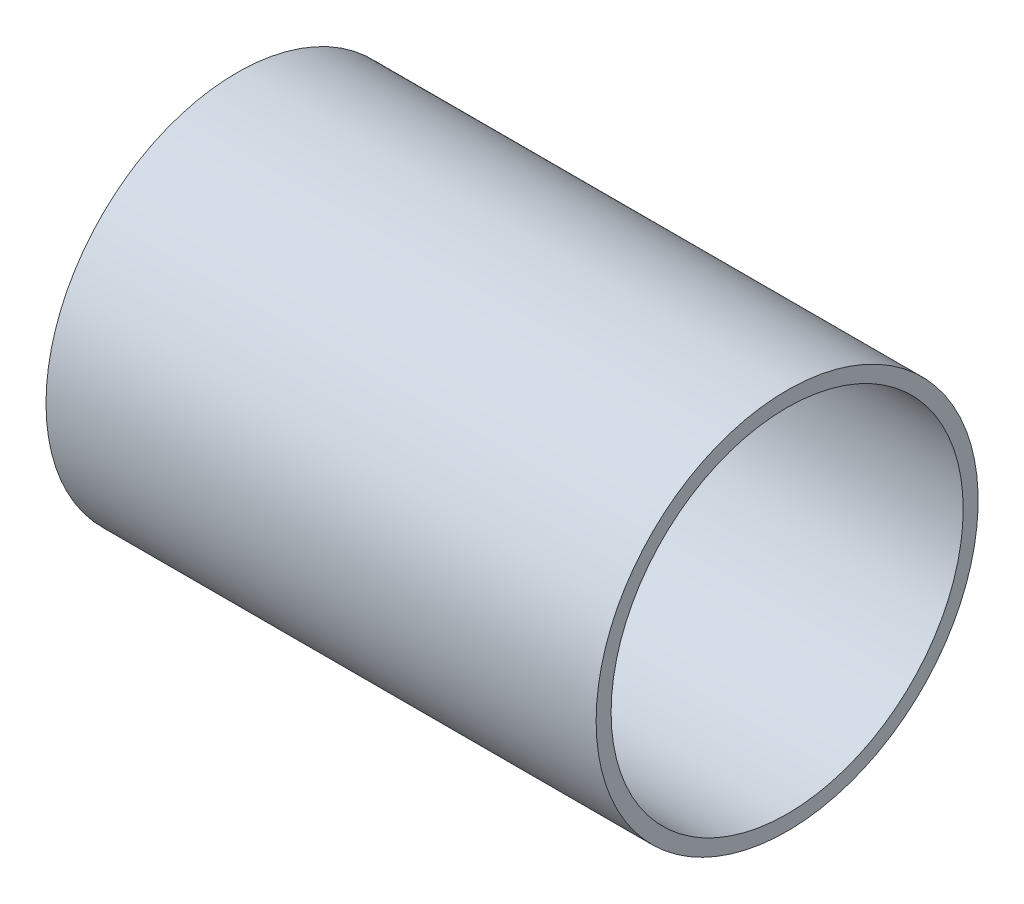
ISO-10303-21;
HEADER;
FILE_DESCRIPTION(('STEP AP214'),'2;1');
FILE_NAME('part.step','',(''),(''),'','','');
FILE_SCHEMA(('AUTOMOTIVE_DESIGN { 1 0 10303 214 1 1 1 1 }'));
ENDSEC;
DATA;
#1=APPLICATION_CONTEXT('core data for automotive mechanical design processes');
#2=APPLICATION_PROTOCOL_DEFINITION('international standard','automotive_design',2000,#1);
#3=PRODUCT_CONTEXT('',#1,'mechanical');
#4=PRODUCT('Part','Part','',(#3));
#5=PRODUCT_RELATED_PRODUCT_CATEGORY('part','',(#4));
#6=PRODUCT_DEFINITION_FORMATION('','',#4);
#7=PRODUCT_DEFINITION_CONTEXT('part definition',#1,'design');
#8=PRODUCT_DEFINITION('design','',#6,#7);
#9=PRODUCT_DEFINITION_SHAPE('','',#8);
#10=(LENGTH_UNIT() NAMED_UNIT(*) SI_UNIT(.MILLI.,.METRE.));
#11=(NAMED_UNIT(*) PLANE_ANGLE_UNIT() SI_UNIT($,.RADIAN.));
#12=(NAMED_UNIT(*) SI_UNIT($,.STERADIAN.) SOLID_ANGLE_UNIT());
#13=UNCERTAINTY_MEASURE_WITH_UNIT(LENGTH_MEASURE(1.E-05),#10,'distance_accuracy_value','');
#14=(GEOMETRIC_REPRESENTATION_CONTEXT(3) GLOBAL_UNCERTAINTY_ASSIGNED_CONTEXT((#13)) GLOBAL_UNIT_ASSIGNED_CONTEXT((#10,
#11,#12)) REPRESENTATION_CONTEXT('',''));
#15=CARTESIAN_POINT('',(0.,0.,0.));
#16=DIRECTION('',(0.,0.,1.));
#17=DIRECTION('',(1.,0.,0.));
#18=AXIS2_PLACEMENT_3D('',#15,#16,#17);
#19=CARTESIAN_POINT('',(-72.8939918967907,0.,0.));
#20=DIRECTION('',(-1.,0.,0.));
#21=DIRECTION('',(0.,0.,1.));
#22=AXIS2_PLACEMENT_3D('',#19,#20,#21);
#23=CYLINDRICAL_SURFACE('',#22,15.875);
#24=CARTESIAN_POINT('',(-22.86,0.,0.));
#25=DIRECTION('',(-1.,0.,0.));
#26=DIRECTION('',(0.,0.,1.));
#27=AXIS2_PLACEMENT_3D('',#24,#25,#26);
#28=CIRCLE('',#27,15.875);
#29=CARTESIAN_POINT('',(-22.86,0.,15.875));
#30=VERTEX_POINT('',#29);
#31=EDGE_CURVE('E46',#30,#30,#28,.T.);
#32=ORIENTED_EDGE('',*,*,#31,.F.);
#33=EDGE_LOOP('',(#32));
#34=FACE_BOUND('',#33,.T.);
#35=CARTESIAN_POINT('',(22.86,0.,0.));
#36=DIRECTION('',(-1.,0.,0.));
#37=DIRECTION('',(0.,0.,1.));
#38=AXIS2_PLACEMENT_3D('',#35,#36,#37);
#39=CIRCLE('',#38,15.875);
#40=CARTESIAN_POINT('',(22.86,0.,15.875));
#41=VERTEX_POINT('',#40);
#42=EDGE_CURVE('E10',#41,#41,#39,.T.);
#43=ORIENTED_EDGE('',*,*,#42,.T.);
#44=EDGE_LOOP('',(#43));
#45=FACE_BOUND('',#44,.T.);
#46=ADVANCED_FACE('F32',(#34,#45),#23,.T.);
#47=CARTESIAN_POINT('',(22.86,0.,-15.875));
#48=DIRECTION('',(-1.,0.,0.));
#49=DIRECTION('',(0.,0.,1.));
#50=AXIS2_PLACEMENT_3D('',#47,#48,#49);
#51=PLANE('',#50);
#52=ORIENTED_EDGE('',*,*,#42,.F.);
#53=EDGE_LOOP('',(#52));
#54=FACE_BOUND('',#53,.T.);
#55=CARTESIAN_POINT('',(22.86,0.,0.));
#56=DIRECTION('',(-1.,0.,0.));
#57=DIRECTION('',(0.,0.,1.));
#58=AXIS2_PLACEMENT_3D('',#55,#56,#57);
#59=CIRCLE('',#58,14.6304);
#60=CARTESIAN_POINT('',(22.86,0.,14.6304));
#61=VERTEX_POINT('',#60);
#62=EDGE_CURVE('E38',#61,#61,#59,.T.);
#63=ORIENTED_EDGE('',*,*,#62,.T.);
#64=EDGE_LOOP('',(#63));
#65=FACE_BOUND('',#64,.T.);
#66=ADVANCED_FACE('F55',(#54,#65),#51,.F.);
#67=CARTESIAN_POINT('',(-72.8939918967907,0.,0.));
#68=DIRECTION('',(-1.,0.,0.));
#69=DIRECTION('',(0.,0.,1.));
#70=AXIS2_PLACEMENT_3D('',#67,#68,#69);
#71=CYLINDRICAL_SURFACE('',#70,14.6304);
#72=ORIENTED_EDGE('',*,*,#62,.F.);
#73=EDGE_LOOP('',(#72));
#74=FACE_BOUND('',#73,.T.);
#75=CARTESIAN_POINT('',(-22.86,0.,0.));
#76=DIRECTION('',(-1.,0.,0.));
#77=DIRECTION('',(0.,0.,1.));
#78=AXIS2_PLACEMENT_3D('',#75,#76,#77);
#79=CIRCLE('',#78,14.6304);
#80=CARTESIAN_POINT('',(-22.86,0.,14.6304));
#81=VERTEX_POINT('',#80);
#82=EDGE_CURVE('E42',#81,#81,#79,.T.);
#83=ORIENTED_EDGE('',*,*,#82,.T.);
#84=EDGE_LOOP('',(#83));
#85=FACE_BOUND('',#84,.T.);
#86=ADVANCED_FACE('F59',(#74,#85),#71,.F.);
#87=CARTESIAN_POINT('',(-22.86,0.,-15.875));
#88=DIRECTION('',(1.,0.,0.));
#89=DIRECTION('',(0.,0.,-1.));
#90=AXIS2_PLACEMENT_3D('',#87,#88,#89);
#91=PLANE('',#90);
#92=ORIENTED_EDGE('',*,*,#82,.F.);
#93=EDGE_LOOP('',(#92));
#94=FACE_BOUND('',#93,.T.);
#95=ORIENTED_EDGE('',*,*,#31,.T.);
#96=EDGE_LOOP('',(#95));
#97=FACE_BOUND('',#96,.T.);
#98=ADVANCED_FACE('F52',(#94,#97),#91,.F.);
#99=CLOSED_SHELL('',(#46,#66,#86,#98));
#100=MANIFOLD_SOLID_BREP('B2',#99);
#101=ADVANCED_BREP_SHAPE_REPRESENTATION('',(#18,#100),#14);
#102=SHAPE_DEFINITION_REPRESENTATION(#9,#101);
ENDSEC;
END-ISO-10303-21;
